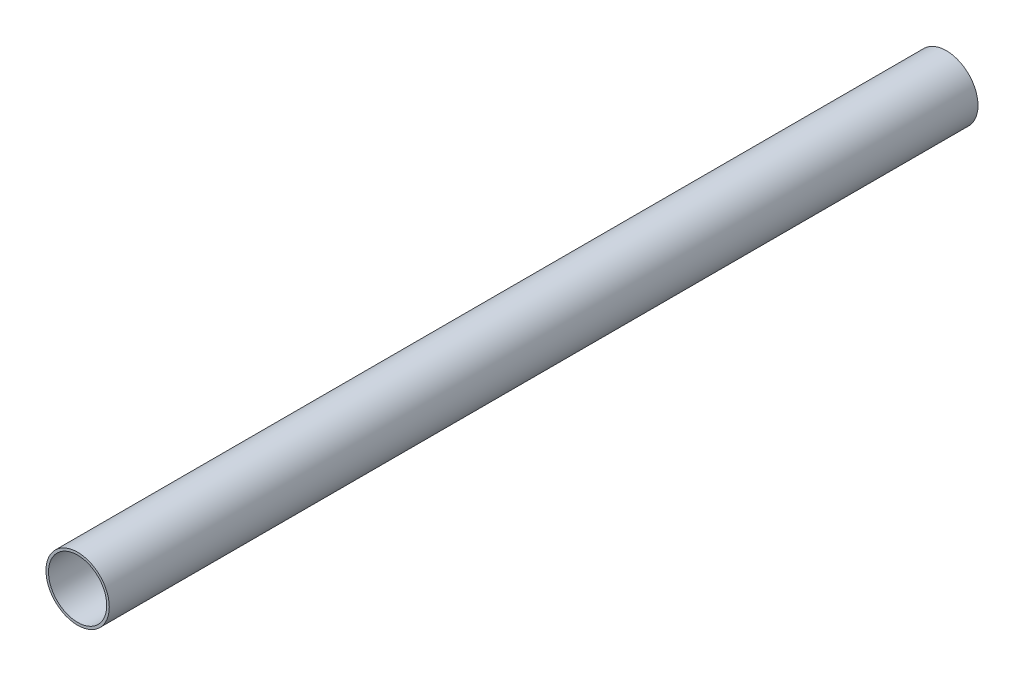
ISO-10303-21;
HEADER;
FILE_DESCRIPTION(('STEP AP214'),'2;1');
FILE_NAME('part.step','',(''),(''),'','','');
FILE_SCHEMA(('AUTOMOTIVE_DESIGN { 1 0 10303 214 1 1 1 1 }'));
ENDSEC;
DATA;
#1=APPLICATION_CONTEXT('core data for automotive mechanical design processes');
#2=APPLICATION_PROTOCOL_DEFINITION('international standard','automotive_design',2000,#1);
#3=PRODUCT_CONTEXT('',#1,'mechanical');
#4=PRODUCT('Part','Part','',(#3));
#5=PRODUCT_RELATED_PRODUCT_CATEGORY('part','',(#4));
#6=PRODUCT_DEFINITION_FORMATION('','',#4);
#7=PRODUCT_DEFINITION_CONTEXT('part definition',#1,'design');
#8=PRODUCT_DEFINITION('design','',#6,#7);
#9=PRODUCT_DEFINITION_SHAPE('','',#8);
#10=(LENGTH_UNIT() NAMED_UNIT(*) SI_UNIT(.MILLI.,.METRE.));
#11=(NAMED_UNIT(*) PLANE_ANGLE_UNIT() SI_UNIT($,.RADIAN.));
#12=(NAMED_UNIT(*) SI_UNIT($,.STERADIAN.) SOLID_ANGLE_UNIT());
#13=UNCERTAINTY_MEASURE_WITH_UNIT(LENGTH_MEASURE(1.E-05),#10,'distance_accuracy_value','');
#14=(GEOMETRIC_REPRESENTATION_CONTEXT(3) GLOBAL_UNCERTAINTY_ASSIGNED_CONTEXT((#13)) GLOBAL_UNIT_ASSIGNED_CONTEXT((#10,
#11,#12)) REPRESENTATION_CONTEXT('',''));
#15=CARTESIAN_POINT('',(0.,0.,0.));
#16=DIRECTION('',(0.,0.,1.));
#17=DIRECTION('',(1.,0.,0.));
#18=AXIS2_PLACEMENT_3D('',#15,#16,#17);
#19=CARTESIAN_POINT('',(0.,0.,152.4));
#20=DIRECTION('',(0.,0.,1.));
#21=DIRECTION('',(1.,0.,0.));
#22=AXIS2_PLACEMENT_3D('',#19,#20,#21);
#23=PLANE('',#22);
#24=CARTESIAN_POINT('',(0.,0.,152.4));
#25=DIRECTION('',(0.,0.,1.));
#26=DIRECTION('',(1.,0.,0.));
#27=AXIS2_PLACEMENT_3D('',#24,#25,#26);
#28=CIRCLE('',#27,11.1125);
#29=CARTESIAN_POINT('',(11.1125,0.,152.4));
#30=VERTEX_POINT('',#29);
#31=EDGE_CURVE('E10',#30,#30,#28,.T.);
#32=ORIENTED_EDGE('',*,*,#31,.T.);
#33=EDGE_LOOP('',(#32));
#34=FACE_BOUND('',#33,.T.);
#35=CARTESIAN_POINT('',(0.,0.,152.4));
#36=DIRECTION('',(0.,0.,1.));
#37=DIRECTION('',(1.,0.,0.));
#38=AXIS2_PLACEMENT_3D('',#35,#36,#37);
#39=CIRCLE('',#38,10.2235);
#40=CARTESIAN_POINT('',(10.2235,0.,152.4));
#41=VERTEX_POINT('',#40);
#42=EDGE_CURVE('E37',#41,#41,#39,.T.);
#43=ORIENTED_EDGE('',*,*,#42,.F.);
#44=EDGE_LOOP('',(#43));
#45=FACE_BOUND('',#44,.T.);
#46=ADVANCED_FACE('F30',(#34,#45),#23,.T.);
#47=CARTESIAN_POINT('',(0.,0.,152.4));
#48=DIRECTION('',(0.,0.,-1.));
#49=DIRECTION('',(-1.,0.,0.));
#50=AXIS2_PLACEMENT_3D('',#47,#48,#49);
#51=CYLINDRICAL_SURFACE('',#50,11.1125);
#52=ORIENTED_EDGE('',*,*,#31,.F.);
#53=EDGE_LOOP('',(#52));
#54=FACE_BOUND('',#53,.T.);
#55=CARTESIAN_POINT('',(0.,0.,-152.4));
#56=DIRECTION('',(0.,0.,1.));
#57=DIRECTION('',(1.,0.,0.));
#58=AXIS2_PLACEMENT_3D('',#55,#56,#57);
#59=CIRCLE('',#58,11.1125);
#60=CARTESIAN_POINT('',(11.1125,0.,-152.4));
#61=VERTEX_POINT('',#60);
#62=EDGE_CURVE('E41',#61,#61,#59,.T.);
#63=ORIENTED_EDGE('',*,*,#62,.T.);
#64=EDGE_LOOP('',(#63));
#65=FACE_BOUND('',#64,.T.);
#66=ADVANCED_FACE('F32',(#54,#65),#51,.T.);
#67=CARTESIAN_POINT('',(0.,0.,152.4));
#68=DIRECTION('',(0.,0.,-1.));
#69=DIRECTION('',(-1.,0.,0.));
#70=AXIS2_PLACEMENT_3D('',#67,#68,#69);
#71=CYLINDRICAL_SURFACE('',#70,10.2235);
#72=ORIENTED_EDGE('',*,*,#42,.T.);
#73=EDGE_LOOP('',(#72));
#74=FACE_BOUND('',#73,.T.);
#75=CARTESIAN_POINT('',(0.,0.,-152.4));
#76=DIRECTION('',(0.,0.,1.));
#77=DIRECTION('',(1.,0.,0.));
#78=AXIS2_PLACEMENT_3D('',#75,#76,#77);
#79=CIRCLE('',#78,10.2235);
#80=CARTESIAN_POINT('',(10.2235,0.,-152.4));
#81=VERTEX_POINT('',#80);
#82=EDGE_CURVE('E45',#81,#81,#79,.T.);
#83=ORIENTED_EDGE('',*,*,#82,.F.);
#84=EDGE_LOOP('',(#83));
#85=FACE_BOUND('',#84,.T.);
#86=ADVANCED_FACE('F54',(#74,#85),#71,.F.);
#87=CARTESIAN_POINT('',(0.,0.,-152.4));
#88=DIRECTION('',(0.,0.,1.));
#89=DIRECTION('',(1.,0.,0.));
#90=AXIS2_PLACEMENT_3D('',#87,#88,#89);
#91=PLANE('',#90);
#92=ORIENTED_EDGE('',*,*,#82,.T.);
#93=EDGE_LOOP('',(#92));
#94=FACE_BOUND('',#93,.T.);
#95=ORIENTED_EDGE('',*,*,#62,.F.);
#96=EDGE_LOOP('',(#95));
#97=FACE_BOUND('',#96,.T.);
#98=ADVANCED_FACE('F51',(#94,#97),#91,.F.);
#99=CLOSED_SHELL('',(#46,#66,#86,#98));
#100=MANIFOLD_SOLID_BREP('B2',#99);
#101=ADVANCED_BREP_SHAPE_REPRESENTATION('',(#18,#100),#14);
#102=SHAPE_DEFINITION_REPRESENTATION(#9,#101);
ENDSEC;
END-ISO-10303-21;
